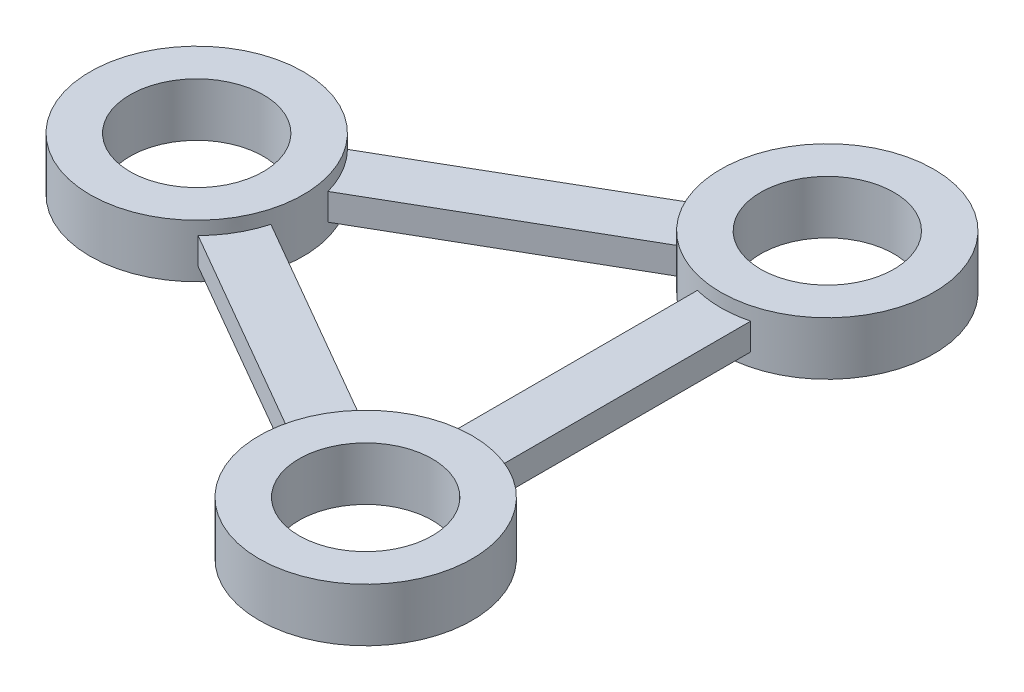
ISO-10303-21;
HEADER;
FILE_DESCRIPTION(('STEP AP214'),'2;1');
FILE_NAME('part.step','',(''),(''),'','','');
FILE_SCHEMA(('AUTOMOTIVE_DESIGN { 1 0 10303 214 1 1 1 1 }'));
ENDSEC;
DATA;
#1=APPLICATION_CONTEXT('core data for automotive mechanical design processes');
#2=APPLICATION_PROTOCOL_DEFINITION('international standard','automotive_design',2000,#1);
#3=PRODUCT_CONTEXT('',#1,'mechanical');
#4=PRODUCT('Part','Part','',(#3));
#5=PRODUCT_RELATED_PRODUCT_CATEGORY('part','',(#4));
#6=PRODUCT_DEFINITION_FORMATION('','',#4);
#7=PRODUCT_DEFINITION_CONTEXT('part definition',#1,'design');
#8=PRODUCT_DEFINITION('design','',#6,#7);
#9=PRODUCT_DEFINITION_SHAPE('','',#8);
#10=(LENGTH_UNIT() NAMED_UNIT(*) SI_UNIT(.MILLI.,.METRE.));
#11=(NAMED_UNIT(*) PLANE_ANGLE_UNIT() SI_UNIT($,.RADIAN.));
#12=(NAMED_UNIT(*) SI_UNIT($,.STERADIAN.) SOLID_ANGLE_UNIT());
#13=UNCERTAINTY_MEASURE_WITH_UNIT(LENGTH_MEASURE(1.E-05),#10,'distance_accuracy_value','');
#14=(GEOMETRIC_REPRESENTATION_CONTEXT(3) GLOBAL_UNCERTAINTY_ASSIGNED_CONTEXT((#13)) GLOBAL_UNIT_ASSIGNED_CONTEXT((#10,
#11,#12)) REPRESENTATION_CONTEXT('',''));
#15=CARTESIAN_POINT('',(0.,0.,0.));
#16=DIRECTION('',(0.,0.,1.));
#17=DIRECTION('',(1.,0.,0.));
#18=AXIS2_PLACEMENT_3D('',#15,#16,#17);
#19=CARTESIAN_POINT('',(-150.,-10.,0.));
#20=DIRECTION('',(0.,1.,0.));
#21=DIRECTION('',(0.,0.,1.));
#22=AXIS2_PLACEMENT_3D('',#19,#20,#21);
#23=CYLINDRICAL_SURFACE('',#22,40.0036895911492);
#24=CARTESIAN_POINT('',(-150.,-10.,0.));
#25=DIRECTION('',(0.,1.,0.));
#26=DIRECTION('',(0.,0.,1.));
#27=AXIS2_PLACEMENT_3D('',#24,#25,#26);
#28=CIRCLE('',#27,40.0036895911492);
#29=CARTESIAN_POINT('',(-150.,-10.,40.0036895911492));
#30=VERTEX_POINT('',#29);
#31=EDGE_CURVE('E11',#30,#30,#28,.T.);
#32=ORIENTED_EDGE('',*,*,#31,.T.);
#33=EDGE_LOOP('',(#32));
#34=FACE_BOUND('',#33,.T.);
#35=CARTESIAN_POINT('',(-150.,10.,0.));
#36=DIRECTION('',(0.,1.,0.));
#37=DIRECTION('',(0.,0.,1.));
#38=AXIS2_PLACEMENT_3D('',#35,#36,#37);
#39=CIRCLE('',#38,40.0036895911492);
#40=CARTESIAN_POINT('',(-150.,10.,40.0036895911492));
#41=VERTEX_POINT('',#40);
#42=EDGE_CURVE('E243',#41,#41,#39,.T.);
#43=ORIENTED_EDGE('',*,*,#42,.F.);
#44=EDGE_LOOP('',(#43));
#45=FACE_BOUND('',#44,.T.);
#46=DIRECTION('',(0.,1.,0.));
#47=VECTOR('',#46,1.);
#48=CARTESIAN_POINT('',(-111.455544285441,-5.,10.706078393763));
#49=LINE('',#48,#47);
#50=CARTESIAN_POINT('',(-111.455544285441,-5.,10.706078393763));
#51=VERTEX_POINT('',#50);
#52=CARTESIAN_POINT('',(-111.455544285441,5.,10.706078393763));
#53=VERTEX_POINT('',#52);
#54=EDGE_CURVE('E233',#51,#53,#49,.T.);
#55=ORIENTED_EDGE('',*,*,#54,.F.);
#56=CARTESIAN_POINT('',(-150.,-5.,0.));
#57=DIRECTION('',(0.,1.,0.));
#58=DIRECTION('',(0.,0.,1.));
#59=AXIS2_PLACEMENT_3D('',#56,#57,#58);
#60=CIRCLE('',#59,40.0036895911492);
#61=CARTESIAN_POINT('',(-121.455324279794,-5.,28.0267134879082));
#62=VERTEX_POINT('',#61);
#63=EDGE_CURVE('E221',#62,#51,#60,.T.);
#64=ORIENTED_EDGE('',*,*,#63,.F.);
#65=DIRECTION('',(0.,1.,0.));
#66=VECTOR('',#65,1.);
#67=CARTESIAN_POINT('',(-121.455324279794,-5.,28.0267134879082));
#68=LINE('',#67,#66);
#69=CARTESIAN_POINT('',(-121.455324279794,5.,28.0267134879082));
#70=VERTEX_POINT('',#69);
#71=EDGE_CURVE('E232',#62,#70,#68,.T.);
#72=ORIENTED_EDGE('',*,*,#71,.T.);
#73=CARTESIAN_POINT('',(-150.,5.,0.));
#74=DIRECTION('',(0.,1.,0.));
#75=DIRECTION('',(0.,0.,1.));
#76=AXIS2_PLACEMENT_3D('',#73,#74,#75);
#77=CIRCLE('',#76,40.0036895911492);
#78=EDGE_CURVE('E209',#70,#53,#77,.T.);
#79=ORIENTED_EDGE('',*,*,#78,.T.);
#80=EDGE_LOOP('',(#55,#64,#72,#79));
#81=FACE_BOUND('',#80,.T.);
#82=DIRECTION('',(0.,-1.,0.));
#83=VECTOR('',#82,1.);
#84=CARTESIAN_POINT('',(-121.455324279794,5.,-28.0267134879081));
#85=LINE('',#84,#83);
#86=CARTESIAN_POINT('',(-121.455324279794,5.,-28.0267134879081));
#87=VERTEX_POINT('',#86);
#88=CARTESIAN_POINT('',(-121.455324279794,-5.,-28.0267134879081));
#89=VERTEX_POINT('',#88);
#90=EDGE_CURVE('E146',#87,#89,#85,.T.);
#91=ORIENTED_EDGE('',*,*,#90,.T.);
#92=CARTESIAN_POINT('',(-150.,-5.,0.));
#93=DIRECTION('',(0.,1.,0.));
#94=DIRECTION('',(0.,0.,1.));
#95=AXIS2_PLACEMENT_3D('',#92,#93,#94);
#96=CIRCLE('',#95,40.0036895911492);
#97=CARTESIAN_POINT('',(-111.455544285441,-5.,-10.7060783937629));
#98=VERTEX_POINT('',#97);
#99=EDGE_CURVE('E142',#98,#89,#96,.T.);
#100=ORIENTED_EDGE('',*,*,#99,.F.);
#101=DIRECTION('',(0.,-1.,0.));
#102=VECTOR('',#101,1.);
#103=CARTESIAN_POINT('',(-111.455544285441,5.,-10.7060783937629));
#104=LINE('',#103,#102);
#105=CARTESIAN_POINT('',(-111.455544285441,5.,-10.7060783937629));
#106=VERTEX_POINT('',#105);
#107=EDGE_CURVE('E123',#106,#98,#104,.T.);
#108=ORIENTED_EDGE('',*,*,#107,.F.);
#109=CARTESIAN_POINT('',(-150.,5.,0.));
#110=DIRECTION('',(0.,1.,0.));
#111=DIRECTION('',(0.,0.,1.));
#112=AXIS2_PLACEMENT_3D('',#109,#110,#111);
#113=CIRCLE('',#112,40.0036895911492);
#114=EDGE_CURVE('E186',#106,#87,#113,.T.);
#115=ORIENTED_EDGE('',*,*,#114,.T.);
#116=EDGE_LOOP('',(#91,#100,#108,#115));
#117=FACE_BOUND('',#116,.T.);
#118=ADVANCED_FACE('F33',(#34,#45,#81,#117),#23,.T.);
#119=CARTESIAN_POINT('',(0.,-10.,-86.6));
#120=DIRECTION('',(0.,1.,0.));
#121=DIRECTION('',(0.,0.,1.));
#122=AXIS2_PLACEMENT_3D('',#119,#120,#121);
#123=CYLINDRICAL_SURFACE('',#122,40.);
#124=CARTESIAN_POINT('',(0.,-5.,-86.6));
#125=DIRECTION('',(0.,1.,0.));
#126=DIRECTION('',(0.,0.,1.));
#127=AXIS2_PLACEMENT_3D('',#124,#125,#126);
#128=CIRCLE('',#127,40.);
#129=CARTESIAN_POINT('',(-9.99999999999997,-5.,-47.8701665379258));
#130=VERTEX_POINT('',#129);
#131=CARTESIAN_POINT('',(9.99999999999997,-5.,-47.8701665379258));
#132=VERTEX_POINT('',#131);
#133=EDGE_CURVE('E148',#130,#132,#128,.T.);
#134=ORIENTED_EDGE('',*,*,#133,.F.);
#135=DIRECTION('',(0.,-1.,0.));
#136=VECTOR('',#135,1.);
#137=CARTESIAN_POINT('',(-9.99999999999997,5.,-47.8701665379258));
#138=LINE('',#137,#136);
#139=CARTESIAN_POINT('',(-9.99999999999997,5.,-47.8701665379258));
#140=VERTEX_POINT('',#139);
#141=EDGE_CURVE('E48',#140,#130,#138,.T.);
#142=ORIENTED_EDGE('',*,*,#141,.F.);
#143=CARTESIAN_POINT('',(0.,5.,-86.6));
#144=DIRECTION('',(0.,1.,0.));
#145=DIRECTION('',(0.,0.,1.));
#146=AXIS2_PLACEMENT_3D('',#143,#144,#145);
#147=CIRCLE('',#146,40.);
#148=CARTESIAN_POINT('',(9.99999999999997,5.,-47.8701665379258));
#149=VERTEX_POINT('',#148);
#150=EDGE_CURVE('E166',#140,#149,#147,.T.);
#151=ORIENTED_EDGE('',*,*,#150,.T.);
#152=DIRECTION('',(0.,-1.,0.));
#153=VECTOR('',#152,1.);
#154=CARTESIAN_POINT('',(9.99999999999997,5.,-47.8701665379258));
#155=LINE('',#154,#153);
#156=EDGE_CURVE('E55',#149,#132,#155,.T.);
#157=ORIENTED_EDGE('',*,*,#156,.T.);
#158=EDGE_LOOP('',(#134,#142,#151,#157));
#159=FACE_BOUND('',#158,.T.);
#160=CARTESIAN_POINT('',(0.,-10.,-86.6));
#161=DIRECTION('',(0.,1.,0.));
#162=DIRECTION('',(0.,0.,1.));
#163=AXIS2_PLACEMENT_3D('',#160,#161,#162);
#164=CIRCLE('',#163,40.);
#165=CARTESIAN_POINT('',(0.,-10.,-46.6));
#166=VERTEX_POINT('',#165);
#167=EDGE_CURVE('E183',#166,#166,#164,.T.);
#168=ORIENTED_EDGE('',*,*,#167,.T.);
#169=EDGE_LOOP('',(#168));
#170=FACE_BOUND('',#169,.T.);
#171=CARTESIAN_POINT('',(0.,10.,-86.6));
#172=DIRECTION('',(0.,1.,0.));
#173=DIRECTION('',(0.,0.,1.));
#174=AXIS2_PLACEMENT_3D('',#171,#172,#173);
#175=CIRCLE('',#174,40.);
#176=CARTESIAN_POINT('',(0.,10.,-46.6));
#177=VERTEX_POINT('',#176);
#178=EDGE_CURVE('E177',#177,#177,#175,.T.);
#179=ORIENTED_EDGE('',*,*,#178,.F.);
#180=EDGE_LOOP('',(#179));
#181=FACE_BOUND('',#180,.T.);
#182=CARTESIAN_POINT('',(0.,-5.,-86.6));
#183=DIRECTION('',(0.,1.,0.));
#184=DIRECTION('',(0.,0.,1.));
#185=AXIS2_PLACEMENT_3D('',#182,#183,#184);
#186=CIRCLE('',#185,40.);
#187=CARTESIAN_POINT('',(-38.5411556298566,-5.,-75.8958268551386));
#188=VERTEX_POINT('',#187);
#189=CARTESIAN_POINT('',(-28.5413756355035,-5.,-58.5751917609935));
#190=VERTEX_POINT('',#189);
#191=EDGE_CURVE('E144',#188,#190,#186,.T.);
#192=ORIENTED_EDGE('',*,*,#191,.F.);
#193=DIRECTION('',(0.,-1.,0.));
#194=VECTOR('',#193,1.);
#195=CARTESIAN_POINT('',(-38.5411556298566,5.,-75.8958268551386));
#196=LINE('',#195,#194);
#197=CARTESIAN_POINT('',(-38.5411556298566,5.,-75.8958268551386));
#198=VERTEX_POINT('',#197);
#199=EDGE_CURVE('E195',#198,#188,#196,.T.);
#200=ORIENTED_EDGE('',*,*,#199,.F.);
#201=CARTESIAN_POINT('',(0.,5.,-86.6));
#202=DIRECTION('',(0.,1.,0.));
#203=DIRECTION('',(0.,0.,1.));
#204=AXIS2_PLACEMENT_3D('',#201,#202,#203);
#205=CIRCLE('',#204,40.);
#206=CARTESIAN_POINT('',(-28.5413756355035,5.,-58.5751917609934));
#207=VERTEX_POINT('',#206);
#208=EDGE_CURVE('E189',#198,#207,#205,.T.);
#209=ORIENTED_EDGE('',*,*,#208,.T.);
#210=DIRECTION('',(0.,-1.,0.));
#211=VECTOR('',#210,1.);
#212=CARTESIAN_POINT('',(-28.5413756355035,5.,-58.5751917609935));
#213=LINE('',#212,#211);
#214=EDGE_CURVE('E135',#207,#190,#213,.T.);
#215=ORIENTED_EDGE('',*,*,#214,.T.);
#216=EDGE_LOOP('',(#192,#200,#209,#215));
#217=FACE_BOUND('',#216,.T.);
#218=ADVANCED_FACE('F253',(#159,#170,#181,#217),#123,.T.);
#219=CARTESIAN_POINT('',(-150.,-10.,0.));
#220=DIRECTION('',(0.,1.,0.));
#221=DIRECTION('',(0.,0.,1.));
#222=AXIS2_PLACEMENT_3D('',#219,#220,#221);
#223=CYLINDRICAL_SURFACE('',#222,25.);
#224=CARTESIAN_POINT('',(-150.,-10.,0.));
#225=DIRECTION('',(0.,1.,0.));
#226=DIRECTION('',(0.,0.,1.));
#227=AXIS2_PLACEMENT_3D('',#224,#225,#226);
#228=CIRCLE('',#227,25.);
#229=CARTESIAN_POINT('',(-150.,-10.,25.));
#230=VERTEX_POINT('',#229);
#231=EDGE_CURVE('E41',#230,#230,#228,.T.);
#232=ORIENTED_EDGE('',*,*,#231,.F.);
#233=EDGE_LOOP('',(#232));
#234=FACE_BOUND('',#233,.T.);
#235=CARTESIAN_POINT('',(-150.,10.,0.));
#236=DIRECTION('',(0.,1.,0.));
#237=DIRECTION('',(0.,0.,1.));
#238=AXIS2_PLACEMENT_3D('',#235,#236,#237);
#239=CIRCLE('',#238,25.);
#240=CARTESIAN_POINT('',(-150.,10.,25.));
#241=VERTEX_POINT('',#240);
#242=EDGE_CURVE('E235',#241,#241,#239,.T.);
#243=ORIENTED_EDGE('',*,*,#242,.T.);
#244=EDGE_LOOP('',(#243));
#245=FACE_BOUND('',#244,.T.);
#246=ADVANCED_FACE('F35',(#234,#245),#223,.F.);
#247=CARTESIAN_POINT('',(0.,-10.,0.));
#248=DIRECTION('',(0.,1.,0.));
#249=DIRECTION('',(0.,0.,1.));
#250=AXIS2_PLACEMENT_3D('',#247,#248,#249);
#251=PLANE('',#250);
#252=ORIENTED_EDGE('',*,*,#231,.T.);
#253=EDGE_LOOP('',(#252));
#254=FACE_BOUND('',#253,.T.);
#255=ORIENTED_EDGE('',*,*,#31,.F.);
#256=EDGE_LOOP('',(#255));
#257=FACE_BOUND('',#256,.T.);
#258=ADVANCED_FACE('F248',(#254,#257),#251,.F.);
#259=CARTESIAN_POINT('',(0.,10.,0.));
#260=DIRECTION('',(0.,1.,0.));
#261=DIRECTION('',(0.,0.,1.));
#262=AXIS2_PLACEMENT_3D('',#259,#260,#261);
#263=PLANE('',#262);
#264=ORIENTED_EDGE('',*,*,#242,.F.);
#265=EDGE_LOOP('',(#264));
#266=FACE_BOUND('',#265,.T.);
#267=ORIENTED_EDGE('',*,*,#42,.T.);
#268=EDGE_LOOP('',(#267));
#269=FACE_BOUND('',#268,.T.);
#270=ADVANCED_FACE('F256',(#266,#269),#263,.T.);
#271=CARTESIAN_POINT('',(-32.4984599786231,-5.,56.2906350668991));
#272=DIRECTION('',(-0.499988999717658,0.,0.86603175470726));
#273=DIRECTION('',(0.86603175470726,0.,0.499988999717658));
#274=AXIS2_PLACEMENT_3D('',#271,#272,#273);
#275=PLANE('',#274);
#276=DIRECTION('',(0.86603175470726,0.,0.499988999717658));
#277=VECTOR('',#276,1.);
#278=CARTESIAN_POINT('',(-32.4984599786231,5.,56.2906350668991));
#279=LINE('',#278,#277);
#280=CARTESIAN_POINT('',(-28.5413756355035,5.,58.5751917609934));
#281=VERTEX_POINT('',#280);
#282=EDGE_CURVE('E218',#53,#281,#279,.T.);
#283=ORIENTED_EDGE('',*,*,#282,.T.);
#284=DIRECTION('',(0.,1.,0.));
#285=VECTOR('',#284,1.);
#286=CARTESIAN_POINT('',(-28.5413756355035,-5.,58.5751917609934));
#287=LINE('',#286,#285);
#288=CARTESIAN_POINT('',(-28.5413756355035,-5.,58.5751917609934));
#289=VERTEX_POINT('',#288);
#290=EDGE_CURVE('E236',#289,#281,#287,.T.);
#291=ORIENTED_EDGE('',*,*,#290,.F.);
#292=DIRECTION('',(0.86603175470726,0.,0.499988999717658));
#293=VECTOR('',#292,1.);
#294=CARTESIAN_POINT('',(-32.4984599786231,-5.,56.2906350668991));
#295=LINE('',#294,#293);
#296=EDGE_CURVE('E229',#51,#289,#295,.T.);
#297=ORIENTED_EDGE('',*,*,#296,.F.);
#298=ORIENTED_EDGE('',*,*,#54,.T.);
#299=EDGE_LOOP('',(#283,#291,#297,#298));
#300=FACE_BOUND('',#299,.T.);
#301=ADVANCED_FACE('F259',(#300),#275,.F.);
#302=CARTESIAN_POINT('',(-42.4982399729762,-5.,73.6112701610443));
#303=DIRECTION('',(-0.499988999717658,0.,0.86603175470726));
#304=DIRECTION('',(0.86603175470726,0.,0.499988999717658));
#305=AXIS2_PLACEMENT_3D('',#302,#303,#304);
#306=PLANE('',#305);
#307=DIRECTION('',(0.86603175470726,0.,0.499988999717658));
#308=VECTOR('',#307,1.);
#309=CARTESIAN_POINT('',(-42.4982399729762,5.,73.6112701610443));
#310=LINE('',#309,#308);
#311=CARTESIAN_POINT('',(-38.5411556298566,5.,75.8958268551387));
#312=VERTEX_POINT('',#311);
#313=EDGE_CURVE('E212',#70,#312,#310,.T.);
#314=ORIENTED_EDGE('',*,*,#313,.F.);
#315=ORIENTED_EDGE('',*,*,#71,.F.);
#316=DIRECTION('',(0.86603175470726,0.,0.499988999717658));
#317=VECTOR('',#316,1.);
#318=CARTESIAN_POINT('',(-42.4982399729762,-5.,73.6112701610443));
#319=LINE('',#318,#317);
#320=CARTESIAN_POINT('',(-38.5411556298566,-5.,75.8958268551387));
#321=VERTEX_POINT('',#320);
#322=EDGE_CURVE('E224',#62,#321,#319,.T.);
#323=ORIENTED_EDGE('',*,*,#322,.T.);
#324=DIRECTION('',(0.,1.,0.));
#325=VECTOR('',#324,1.);
#326=CARTESIAN_POINT('',(-38.5411556298566,-5.,75.8958268551386));
#327=LINE('',#326,#325);
#328=EDGE_CURVE('E238',#321,#312,#327,.T.);
#329=ORIENTED_EDGE('',*,*,#328,.T.);
#330=EDGE_LOOP('',(#314,#315,#323,#329));
#331=FACE_BOUND('',#330,.T.);
#332=ADVANCED_FACE('F278',(#331),#306,.T.);
#333=CARTESIAN_POINT('',(0.,-5.,0.));
#334=DIRECTION('',(0.,1.,0.));
#335=DIRECTION('',(0.,0.,1.));
#336=AXIS2_PLACEMENT_3D('',#333,#334,#335);
#337=PLANE('',#336);
#338=ORIENTED_EDGE('',*,*,#63,.T.);
#339=ORIENTED_EDGE('',*,*,#296,.T.);
#340=CARTESIAN_POINT('',(0.,-5.,86.6));
#341=DIRECTION('',(0.,1.,0.));
#342=DIRECTION('',(0.,0.,1.));
#343=AXIS2_PLACEMENT_3D('',#340,#341,#342);
#344=CIRCLE('',#343,40.);
#345=EDGE_CURVE('E227',#321,#289,#344,.F.);
#346=ORIENTED_EDGE('',*,*,#345,.F.);
#347=ORIENTED_EDGE('',*,*,#322,.F.);
#348=EDGE_LOOP('',(#338,#339,#346,#347));
#349=FACE_BOUND('',#348,.T.);
#350=ADVANCED_FACE('F275',(#349),#337,.F.);
#351=CARTESIAN_POINT('',(0.,5.,0.));
#352=DIRECTION('',(0.,1.,0.));
#353=DIRECTION('',(0.,0.,1.));
#354=AXIS2_PLACEMENT_3D('',#351,#352,#353);
#355=PLANE('',#354);
#356=ORIENTED_EDGE('',*,*,#78,.F.);
#357=ORIENTED_EDGE('',*,*,#313,.T.);
#358=CARTESIAN_POINT('',(0.,5.,86.6));
#359=DIRECTION('',(0.,1.,0.));
#360=DIRECTION('',(0.,0.,1.));
#361=AXIS2_PLACEMENT_3D('',#358,#359,#360);
#362=CIRCLE('',#361,40.);
#363=EDGE_CURVE('E215',#312,#281,#362,.F.);
#364=ORIENTED_EDGE('',*,*,#363,.T.);
#365=ORIENTED_EDGE('',*,*,#282,.F.);
#366=EDGE_LOOP('',(#356,#357,#364,#365));
#367=FACE_BOUND('',#366,.T.);
#368=ADVANCED_FACE('F281',(#367),#355,.T.);
#369=CARTESIAN_POINT('',(0.,-10.,86.6));
#370=DIRECTION('',(0.,1.,0.));
#371=DIRECTION('',(0.,0.,1.));
#372=AXIS2_PLACEMENT_3D('',#369,#370,#371);
#373=CYLINDRICAL_SURFACE('',#372,40.);
#374=DIRECTION('',(0.,-1.,0.));
#375=VECTOR('',#374,1.);
#376=CARTESIAN_POINT('',(-9.99999999999997,5.,47.8701665379258));
#377=LINE('',#376,#375);
#378=CARTESIAN_POINT('',(-9.99999999999997,5.,47.8701665379258));
#379=VERTEX_POINT('',#378);
#380=CARTESIAN_POINT('',(-9.99999999999997,-5.,47.8701665379258));
#381=VERTEX_POINT('',#380);
#382=EDGE_CURVE('E172',#379,#381,#377,.T.);
#383=ORIENTED_EDGE('',*,*,#382,.T.);
#384=CARTESIAN_POINT('',(0.,-5.,86.6));
#385=DIRECTION('',(0.,1.,0.));
#386=DIRECTION('',(0.,0.,1.));
#387=AXIS2_PLACEMENT_3D('',#384,#385,#386);
#388=CIRCLE('',#387,40.);
#389=CARTESIAN_POINT('',(9.99999999999997,-5.,47.8701665379258));
#390=VERTEX_POINT('',#389);
#391=EDGE_CURVE('E492',#381,#390,#388,.F.);
#392=ORIENTED_EDGE('',*,*,#391,.T.);
#393=DIRECTION('',(0.,-1.,0.));
#394=VECTOR('',#393,1.);
#395=CARTESIAN_POINT('',(9.99999999999997,5.,47.8701665379258));
#396=LINE('',#395,#394);
#397=CARTESIAN_POINT('',(9.99999999999997,5.,47.8701665379258));
#398=VERTEX_POINT('',#397);
#399=EDGE_CURVE('E170',#398,#390,#396,.T.);
#400=ORIENTED_EDGE('',*,*,#399,.F.);
#401=CARTESIAN_POINT('',(0.,5.,86.6));
#402=DIRECTION('',(0.,1.,0.));
#403=DIRECTION('',(0.,0.,1.));
#404=AXIS2_PLACEMENT_3D('',#401,#402,#403);
#405=CIRCLE('',#404,40.);
#406=EDGE_CURVE('E160',#379,#398,#405,.F.);
#407=ORIENTED_EDGE('',*,*,#406,.F.);
#408=EDGE_LOOP('',(#383,#392,#400,#407));
#409=FACE_BOUND('',#408,.T.);
#410=CARTESIAN_POINT('',(0.,-10.,86.6));
#411=DIRECTION('',(0.,1.,0.));
#412=DIRECTION('',(0.,0.,1.));
#413=AXIS2_PLACEMENT_3D('',#410,#411,#412);
#414=CIRCLE('',#413,40.);
#415=CARTESIAN_POINT('',(0.,-10.,126.6));
#416=VERTEX_POINT('',#415);
#417=EDGE_CURVE('E203',#416,#416,#414,.F.);
#418=ORIENTED_EDGE('',*,*,#417,.F.);
#419=EDGE_LOOP('',(#418));
#420=FACE_BOUND('',#419,.T.);
#421=CARTESIAN_POINT('',(0.,10.,86.6));
#422=DIRECTION('',(0.,1.,0.));
#423=DIRECTION('',(0.,0.,1.));
#424=AXIS2_PLACEMENT_3D('',#421,#422,#423);
#425=CIRCLE('',#424,40.);
#426=CARTESIAN_POINT('',(0.,10.,126.6));
#427=VERTEX_POINT('',#426);
#428=EDGE_CURVE('E134',#427,#427,#425,.F.);
#429=ORIENTED_EDGE('',*,*,#428,.T.);
#430=EDGE_LOOP('',(#429));
#431=FACE_BOUND('',#430,.T.);
#432=ORIENTED_EDGE('',*,*,#328,.F.);
#433=ORIENTED_EDGE('',*,*,#345,.T.);
#434=ORIENTED_EDGE('',*,*,#290,.T.);
#435=ORIENTED_EDGE('',*,*,#363,.F.);
#436=EDGE_LOOP('',(#432,#433,#434,#435));
#437=FACE_BOUND('',#436,.T.);
#438=ADVANCED_FACE('F283',(#409,#420,#431,#437),#373,.T.);
#439=CARTESIAN_POINT('',(0.,-10.,86.6));
#440=DIRECTION('',(0.,1.,0.));
#441=DIRECTION('',(0.,0.,1.));
#442=AXIS2_PLACEMENT_3D('',#439,#440,#441);
#443=CYLINDRICAL_SURFACE('',#442,25.);
#444=CARTESIAN_POINT('',(0.,-10.,86.6));
#445=DIRECTION('',(0.,1.,0.));
#446=DIRECTION('',(0.,0.,1.));
#447=AXIS2_PLACEMENT_3D('',#444,#445,#446);
#448=CIRCLE('',#447,25.);
#449=CARTESIAN_POINT('',(0.,-10.,111.6));
#450=VERTEX_POINT('',#449);
#451=EDGE_CURVE('E206',#450,#450,#448,.F.);
#452=ORIENTED_EDGE('',*,*,#451,.T.);
#453=EDGE_LOOP('',(#452));
#454=FACE_BOUND('',#453,.T.);
#455=CARTESIAN_POINT('',(0.,10.,86.6));
#456=DIRECTION('',(0.,1.,0.));
#457=DIRECTION('',(0.,0.,1.));
#458=AXIS2_PLACEMENT_3D('',#455,#456,#457);
#459=CIRCLE('',#458,25.);
#460=CARTESIAN_POINT('',(0.,10.,111.6));
#461=VERTEX_POINT('',#460);
#462=EDGE_CURVE('E200',#461,#461,#459,.F.);
#463=ORIENTED_EDGE('',*,*,#462,.F.);
#464=EDGE_LOOP('',(#463));
#465=FACE_BOUND('',#464,.T.);
#466=ADVANCED_FACE('F285',(#454,#465),#443,.F.);
#467=CARTESIAN_POINT('',(0.,-10.,0.));
#468=DIRECTION('',(0.,1.,0.));
#469=DIRECTION('',(0.,0.,1.));
#470=AXIS2_PLACEMENT_3D('',#467,#468,#469);
#471=PLANE('',#470);
#472=ORIENTED_EDGE('',*,*,#417,.T.);
#473=EDGE_LOOP('',(#472));
#474=FACE_BOUND('',#473,.T.);
#475=ORIENTED_EDGE('',*,*,#451,.F.);
#476=EDGE_LOOP('',(#475));
#477=FACE_BOUND('',#476,.T.);
#478=ADVANCED_FACE('F292',(#474,#477),#471,.F.);
#479=CARTESIAN_POINT('',(0.,10.,0.));
#480=DIRECTION('',(0.,1.,0.));
#481=DIRECTION('',(0.,0.,1.));
#482=AXIS2_PLACEMENT_3D('',#479,#480,#481);
#483=PLANE('',#482);
#484=ORIENTED_EDGE('',*,*,#428,.F.);
#485=EDGE_LOOP('',(#484));
#486=FACE_BOUND('',#485,.T.);
#487=ORIENTED_EDGE('',*,*,#462,.T.);
#488=EDGE_LOOP('',(#487));
#489=FACE_BOUND('',#488,.T.);
#490=ADVANCED_FACE('F353',(#486,#489),#483,.T.);
#491=CARTESIAN_POINT('',(-32.4984599786231,5.,-56.2906350668991));
#492=DIRECTION('',(-0.499988999717658,0.,-0.86603175470726));
#493=DIRECTION('',(-0.86603175470726,0.,0.499988999717658));
#494=AXIS2_PLACEMENT_3D('',#491,#492,#493);
#495=PLANE('',#494);
#496=ORIENTED_EDGE('',*,*,#107,.T.);
#497=DIRECTION('',(0.86603175470726,0.,-0.499988999717658));
#498=VECTOR('',#497,1.);
#499=CARTESIAN_POINT('',(-32.4984599786231,-5.,-56.2906350668991));
#500=LINE('',#499,#498);
#501=EDGE_CURVE('E127',#98,#190,#500,.T.);
#502=ORIENTED_EDGE('',*,*,#501,.T.);
#503=ORIENTED_EDGE('',*,*,#214,.F.);
#504=DIRECTION('',(0.86603175470726,0.,-0.499988999717658));
#505=VECTOR('',#504,1.);
#506=CARTESIAN_POINT('',(-32.4984599786231,5.,-56.2906350668991));
#507=LINE('',#506,#505);
#508=EDGE_CURVE('E129',#106,#207,#507,.T.);
#509=ORIENTED_EDGE('',*,*,#508,.F.);
#510=EDGE_LOOP('',(#496,#502,#503,#509));
#511=FACE_BOUND('',#510,.T.);
#512=ADVANCED_FACE('F125',(#511),#495,.F.);
#513=CARTESIAN_POINT('',(-42.4982399729762,5.,-73.6112701610442));
#514=DIRECTION('',(-0.499988999717658,0.,-0.86603175470726));
#515=DIRECTION('',(-0.86603175470726,0.,0.499988999717658));
#516=AXIS2_PLACEMENT_3D('',#513,#514,#515);
#517=PLANE('',#516);
#518=ORIENTED_EDGE('',*,*,#199,.T.);
#519=DIRECTION('',(0.86603175470726,0.,-0.499988999717658));
#520=VECTOR('',#519,1.);
#521=CARTESIAN_POINT('',(-42.4982399729762,-5.,-73.6112701610442));
#522=LINE('',#521,#520);
#523=EDGE_CURVE('E155',#89,#188,#522,.T.);
#524=ORIENTED_EDGE('',*,*,#523,.F.);
#525=ORIENTED_EDGE('',*,*,#90,.F.);
#526=DIRECTION('',(0.86603175470726,0.,-0.499988999717658));
#527=VECTOR('',#526,1.);
#528=CARTESIAN_POINT('',(-42.4982399729762,5.,-73.6112701610442));
#529=LINE('',#528,#527);
#530=EDGE_CURVE('E191',#87,#198,#529,.T.);
#531=ORIENTED_EDGE('',*,*,#530,.T.);
#532=EDGE_LOOP('',(#518,#524,#525,#531));
#533=FACE_BOUND('',#532,.T.);
#534=ADVANCED_FACE('F372',(#533),#517,.T.);
#535=CARTESIAN_POINT('',(0.,5.,0.));
#536=DIRECTION('',(0.,1.,0.));
#537=DIRECTION('',(0.,0.,1.));
#538=AXIS2_PLACEMENT_3D('',#535,#536,#537);
#539=PLANE('',#538);
#540=ORIENTED_EDGE('',*,*,#114,.F.);
#541=ORIENTED_EDGE('',*,*,#508,.T.);
#542=ORIENTED_EDGE('',*,*,#208,.F.);
#543=ORIENTED_EDGE('',*,*,#530,.F.);
#544=EDGE_LOOP('',(#540,#541,#542,#543));
#545=FACE_BOUND('',#544,.T.);
#546=ADVANCED_FACE('F382',(#545),#539,.T.);
#547=CARTESIAN_POINT('',(0.,-10.,-86.6));
#548=DIRECTION('',(0.,1.,0.));
#549=DIRECTION('',(0.,0.,1.));
#550=AXIS2_PLACEMENT_3D('',#547,#548,#549);
#551=CYLINDRICAL_SURFACE('',#550,25.);
#552=CARTESIAN_POINT('',(0.,-10.,-86.6));
#553=DIRECTION('',(0.,1.,0.));
#554=DIRECTION('',(0.,0.,1.));
#555=AXIS2_PLACEMENT_3D('',#552,#553,#554);
#556=CIRCLE('',#555,25.);
#557=CARTESIAN_POINT('',(0.,-10.,-61.6));
#558=VERTEX_POINT('',#557);
#559=EDGE_CURVE('E180',#558,#558,#556,.T.);
#560=ORIENTED_EDGE('',*,*,#559,.F.);
#561=EDGE_LOOP('',(#560));
#562=FACE_BOUND('',#561,.T.);
#563=CARTESIAN_POINT('',(0.,10.,-86.6));
#564=DIRECTION('',(0.,1.,0.));
#565=DIRECTION('',(0.,0.,1.));
#566=AXIS2_PLACEMENT_3D('',#563,#564,#565);
#567=CIRCLE('',#566,25.);
#568=CARTESIAN_POINT('',(0.,10.,-61.6));
#569=VERTEX_POINT('',#568);
#570=EDGE_CURVE('E174',#569,#569,#567,.T.);
#571=ORIENTED_EDGE('',*,*,#570,.T.);
#572=EDGE_LOOP('',(#571));
#573=FACE_BOUND('',#572,.T.);
#574=ADVANCED_FACE('F392',(#562,#573),#551,.F.);
#575=CARTESIAN_POINT('',(0.,-10.,0.));
#576=DIRECTION('',(0.,1.,0.));
#577=DIRECTION('',(0.,0.,1.));
#578=AXIS2_PLACEMENT_3D('',#575,#576,#577);
#579=PLANE('',#578);
#580=ORIENTED_EDGE('',*,*,#559,.T.);
#581=EDGE_LOOP('',(#580));
#582=FACE_BOUND('',#581,.T.);
#583=ORIENTED_EDGE('',*,*,#167,.F.);
#584=EDGE_LOOP('',(#583));
#585=FACE_BOUND('',#584,.T.);
#586=ADVANCED_FACE('F402',(#582,#585),#579,.F.);
#587=CARTESIAN_POINT('',(0.,10.,0.));
#588=DIRECTION('',(0.,1.,0.));
#589=DIRECTION('',(0.,0.,1.));
#590=AXIS2_PLACEMENT_3D('',#587,#588,#589);
#591=PLANE('',#590);
#592=ORIENTED_EDGE('',*,*,#570,.F.);
#593=EDGE_LOOP('',(#592));
#594=FACE_BOUND('',#593,.T.);
#595=ORIENTED_EDGE('',*,*,#178,.T.);
#596=EDGE_LOOP('',(#595));
#597=FACE_BOUND('',#596,.T.);
#598=ADVANCED_FACE('F412',(#594,#597),#591,.T.);
#599=CARTESIAN_POINT('',(-9.99999999999997,5.,0.));
#600=DIRECTION('',(1.,0.,0.));
#601=DIRECTION('',(0.,0.,-1.));
#602=AXIS2_PLACEMENT_3D('',#599,#600,#601);
#603=PLANE('',#602);
#604=ORIENTED_EDGE('',*,*,#141,.T.);
#605=DIRECTION('',(0.,0.,1.));
#606=VECTOR('',#605,1.);
#607=CARTESIAN_POINT('',(-9.99999999999997,-5.,0.));
#608=LINE('',#607,#606);
#609=EDGE_CURVE('E490',#130,#381,#608,.T.);
#610=ORIENTED_EDGE('',*,*,#609,.T.);
#611=ORIENTED_EDGE('',*,*,#382,.F.);
#612=DIRECTION('',(0.,0.,1.));
#613=VECTOR('',#612,1.);
#614=CARTESIAN_POINT('',(-9.99999999999997,5.,0.));
#615=LINE('',#614,#613);
#616=EDGE_CURVE('E157',#140,#379,#615,.T.);
#617=ORIENTED_EDGE('',*,*,#616,.F.);
#618=EDGE_LOOP('',(#604,#610,#611,#617));
#619=FACE_BOUND('',#618,.T.);
#620=ADVANCED_FACE('F422',(#619),#603,.F.);
#621=CARTESIAN_POINT('',(9.99999999999997,5.,0.));
#622=DIRECTION('',(1.,0.,0.));
#623=DIRECTION('',(0.,0.,-1.));
#624=AXIS2_PLACEMENT_3D('',#621,#622,#623);
#625=PLANE('',#624);
#626=ORIENTED_EDGE('',*,*,#399,.T.);
#627=DIRECTION('',(0.,0.,1.));
#628=VECTOR('',#627,1.);
#629=CARTESIAN_POINT('',(9.99999999999997,-5.,0.));
#630=LINE('',#629,#628);
#631=EDGE_CURVE('E150',#132,#390,#630,.T.);
#632=ORIENTED_EDGE('',*,*,#631,.F.);
#633=ORIENTED_EDGE('',*,*,#156,.F.);
#634=DIRECTION('',(0.,0.,1.));
#635=VECTOR('',#634,1.);
#636=CARTESIAN_POINT('',(9.99999999999997,5.,0.));
#637=LINE('',#636,#635);
#638=EDGE_CURVE('E163',#149,#398,#637,.T.);
#639=ORIENTED_EDGE('',*,*,#638,.T.);
#640=EDGE_LOOP('',(#626,#632,#633,#639));
#641=FACE_BOUND('',#640,.T.);
#642=ADVANCED_FACE('F433',(#641),#625,.T.);
#643=CARTESIAN_POINT('',(0.,5.,0.));
#644=DIRECTION('',(0.,1.,0.));
#645=DIRECTION('',(0.,0.,1.));
#646=AXIS2_PLACEMENT_3D('',#643,#644,#645);
#647=PLANE('',#646);
#648=ORIENTED_EDGE('',*,*,#616,.T.);
#649=ORIENTED_EDGE('',*,*,#406,.T.);
#650=ORIENTED_EDGE('',*,*,#638,.F.);
#651=ORIENTED_EDGE('',*,*,#150,.F.);
#652=EDGE_LOOP('',(#648,#649,#650,#651));
#653=FACE_BOUND('',#652,.T.);
#654=ADVANCED_FACE('F443',(#653),#647,.T.);
#655=CARTESIAN_POINT('',(0.,-5.,0.));
#656=DIRECTION('',(0.,1.,0.));
#657=DIRECTION('',(0.,0.,1.));
#658=AXIS2_PLACEMENT_3D('',#655,#656,#657);
#659=PLANE('',#658);
#660=ORIENTED_EDGE('',*,*,#99,.T.);
#661=ORIENTED_EDGE('',*,*,#523,.T.);
#662=ORIENTED_EDGE('',*,*,#191,.T.);
#663=ORIENTED_EDGE('',*,*,#501,.F.);
#664=EDGE_LOOP('',(#660,#661,#662,#663));
#665=FACE_BOUND('',#664,.T.);
#666=ADVANCED_FACE('F140',(#665),#659,.F.);
#667=CARTESIAN_POINT('',(0.,-5.,0.));
#668=DIRECTION('',(0.,1.,0.));
#669=DIRECTION('',(0.,0.,1.));
#670=AXIS2_PLACEMENT_3D('',#667,#668,#669);
#671=PLANE('',#670);
#672=ORIENTED_EDGE('',*,*,#609,.F.);
#673=ORIENTED_EDGE('',*,*,#133,.T.);
#674=ORIENTED_EDGE('',*,*,#631,.T.);
#675=ORIENTED_EDGE('',*,*,#391,.F.);
#676=EDGE_LOOP('',(#672,#673,#674,#675));
#677=FACE_BOUND('',#676,.T.);
#678=ADVANCED_FACE('F462',(#677),#671,.F.);
#679=CLOSED_SHELL('',(#118,#218,#246,#258,#270,#301,#332,#350,#368,#438,#466,#478,#490,#512,
#534,#546,#574,#586,#598,#620,#642,#654,#666,#678));
#680=MANIFOLD_SOLID_BREP('B2',#679);
#681=ADVANCED_BREP_SHAPE_REPRESENTATION('',(#18,#680),#14);
#682=SHAPE_DEFINITION_REPRESENTATION(#9,#681);
ENDSEC;
END-ISO-10303-21;
